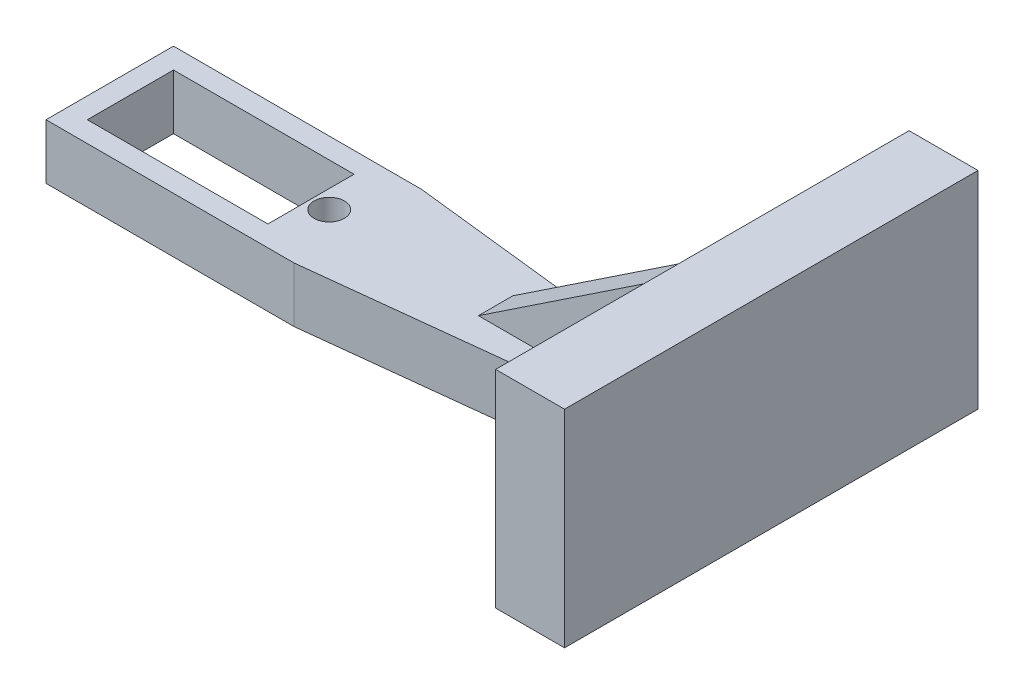
ISO-10303-21;
HEADER;
FILE_DESCRIPTION(('STEP AP214'),'2;1');
FILE_NAME('part.step','',(''),(''),'','','');
FILE_SCHEMA(('AUTOMOTIVE_DESIGN { 1 0 10303 214 1 1 1 1 }'));
ENDSEC;
DATA;
#1=APPLICATION_CONTEXT('core data for automotive mechanical design processes');
#2=APPLICATION_PROTOCOL_DEFINITION('international standard','automotive_design',2000,#1);
#3=PRODUCT_CONTEXT('',#1,'mechanical');
#4=PRODUCT('Part','Part','',(#3));
#5=PRODUCT_RELATED_PRODUCT_CATEGORY('part','',(#4));
#6=PRODUCT_DEFINITION_FORMATION('','',#4);
#7=PRODUCT_DEFINITION_CONTEXT('part definition',#1,'design');
#8=PRODUCT_DEFINITION('design','',#6,#7);
#9=PRODUCT_DEFINITION_SHAPE('','',#8);
#10=(LENGTH_UNIT() NAMED_UNIT(*) SI_UNIT(.MILLI.,.METRE.));
#11=(NAMED_UNIT(*) PLANE_ANGLE_UNIT() SI_UNIT($,.RADIAN.));
#12=(NAMED_UNIT(*) SI_UNIT($,.STERADIAN.) SOLID_ANGLE_UNIT());
#13=UNCERTAINTY_MEASURE_WITH_UNIT(LENGTH_MEASURE(1.E-05),#10,'distance_accuracy_value','');
#14=(GEOMETRIC_REPRESENTATION_CONTEXT(3) GLOBAL_UNCERTAINTY_ASSIGNED_CONTEXT((#13)) GLOBAL_UNIT_ASSIGNED_CONTEXT((#10,
#11,#12)) REPRESENTATION_CONTEXT('',''));
#15=CARTESIAN_POINT('',(0.,0.,0.));
#16=DIRECTION('',(0.,0.,1.));
#17=DIRECTION('',(1.,0.,0.));
#18=AXIS2_PLACEMENT_3D('',#15,#16,#17);
#19=CARTESIAN_POINT('',(0.,8.,0.));
#20=DIRECTION('',(0.,-1.,0.));
#21=DIRECTION('',(0.,0.,-1.));
#22=AXIS2_PLACEMENT_3D('',#19,#20,#21);
#23=PLANE('',#22);
#24=DIRECTION('',(0.,0.,1.));
#25=VECTOR('',#24,1.);
#26=CARTESIAN_POINT('',(-33.,8.,-6.25));
#27=LINE('',#26,#25);
#28=CARTESIAN_POINT('',(-33.,8.,-6.25));
#29=VERTEX_POINT('',#28);
#30=CARTESIAN_POINT('',(-33.,8.,6.25));
#31=VERTEX_POINT('',#30);
#32=EDGE_CURVE('E270',#29,#31,#27,.T.);
#33=ORIENTED_EDGE('',*,*,#32,.F.);
#34=DIRECTION('',(-1.,0.,0.));
#35=VECTOR('',#34,1.);
#36=CARTESIAN_POINT('',(-6.8,8.,-6.25));
#37=LINE('',#36,#35);
#38=CARTESIAN_POINT('',(-6.8,8.,-6.25));
#39=VERTEX_POINT('',#38);
#40=EDGE_CURVE('E278',#39,#29,#37,.T.);
#41=ORIENTED_EDGE('',*,*,#40,.F.);
#42=DIRECTION('',(0.,0.,-1.));
#43=VECTOR('',#42,1.);
#44=CARTESIAN_POINT('',(-6.8,8.,-6.25));
#45=LINE('',#44,#43);
#46=CARTESIAN_POINT('',(-6.79999999999999,8.,6.25));
#47=VERTEX_POINT('',#46);
#48=EDGE_CURVE('E275',#47,#39,#45,.T.);
#49=ORIENTED_EDGE('',*,*,#48,.F.);
#50=DIRECTION('',(1.,0.,0.));
#51=VECTOR('',#50,1.);
#52=CARTESIAN_POINT('',(-29.2,8.,6.25));
#53=LINE('',#52,#51);
#54=EDGE_CURVE('E272',#31,#47,#53,.T.);
#55=ORIENTED_EDGE('',*,*,#54,.F.);
#56=EDGE_LOOP('',(#33,#41,#49,#55));
#57=FACE_BOUND('',#56,.T.);
#58=CARTESIAN_POINT('',(-4.15,8.,0.));
#59=DIRECTION('',(0.,1.,0.));
#60=DIRECTION('',(0.,0.,1.));
#61=AXIS2_PLACEMENT_3D('',#58,#59,#60);
#62=CIRCLE('',#61,2.19999999999999);
#63=CARTESIAN_POINT('',(-4.15,8.,2.19999999999999));
#64=VERTEX_POINT('',#63);
#65=EDGE_CURVE('E257',#64,#64,#62,.T.);
#66=ORIENTED_EDGE('',*,*,#65,.F.);
#67=EDGE_LOOP('',(#66));
#68=FACE_BOUND('',#67,.T.);
#69=DIRECTION('',(1.,0.,0.));
#70=VECTOR('',#69,1.);
#71=CARTESIAN_POINT('',(50.,8.,2.5));
#72=LINE('',#71,#70);
#73=CARTESIAN_POINT('',(20.,8.,2.5));
#74=VERTEX_POINT('',#73);
#75=CARTESIAN_POINT('',(50.,8.,2.5));
#76=VERTEX_POINT('',#75);
#77=EDGE_CURVE('E73',#74,#76,#72,.T.);
#78=ORIENTED_EDGE('',*,*,#77,.F.);
#79=DIRECTION('',(0.,0.,-1.));
#80=VECTOR('',#79,1.);
#81=CARTESIAN_POINT('',(20.,8.,2.5));
#82=LINE('',#81,#80);
#83=CARTESIAN_POINT('',(20.,8.,-2.5));
#84=VERTEX_POINT('',#83);
#85=EDGE_CURVE('E78',#74,#84,#82,.T.);
#86=ORIENTED_EDGE('',*,*,#85,.T.);
#87=DIRECTION('',(1.,0.,0.));
#88=VECTOR('',#87,1.);
#89=CARTESIAN_POINT('',(50.,8.,-2.5));
#90=LINE('',#89,#88);
#91=CARTESIAN_POINT('',(50.,8.,-2.5));
#92=VERTEX_POINT('',#91);
#93=EDGE_CURVE('E190',#84,#92,#90,.T.);
#94=ORIENTED_EDGE('',*,*,#93,.T.);
#95=DIRECTION('',(0.,0.,-1.));
#96=VECTOR('',#95,1.);
#97=CARTESIAN_POINT('',(50.,8.,0.));
#98=LINE('',#97,#96);
#99=CARTESIAN_POINT('',(50.,8.,-3.625));
#100=VERTEX_POINT('',#99);
#101=EDGE_CURVE('E177',#92,#100,#98,.T.);
#102=ORIENTED_EDGE('',*,*,#101,.T.);
#103=DIRECTION('',(0.993731316158802,0.,0.111794773067865));
#104=VECTOR('',#103,1.);
#105=CARTESIAN_POINT('',(0.,8.,-9.25));
#106=LINE('',#105,#104);
#107=CARTESIAN_POINT('',(2.03418209003144E-13,8.,-9.24999999999999));
#108=VERTEX_POINT('',#107);
#109=EDGE_CURVE('E238',#108,#100,#106,.T.);
#110=ORIENTED_EDGE('',*,*,#109,.F.);
#111=DIRECTION('',(-1.,0.,0.));
#112=VECTOR('',#111,1.);
#113=CARTESIAN_POINT('',(-36.,8.,-9.25));
#114=LINE('',#113,#112);
#115=CARTESIAN_POINT('',(-36.,8.,-9.25));
#116=VERTEX_POINT('',#115);
#117=EDGE_CURVE('E314',#108,#116,#114,.T.);
#118=ORIENTED_EDGE('',*,*,#117,.T.);
#119=DIRECTION('',(0.,0.,1.));
#120=VECTOR('',#119,1.);
#121=CARTESIAN_POINT('',(-36.,8.,9.25));
#122=LINE('',#121,#120);
#123=CARTESIAN_POINT('',(-36.,8.,9.25));
#124=VERTEX_POINT('',#123);
#125=EDGE_CURVE('E302',#116,#124,#122,.T.);
#126=ORIENTED_EDGE('',*,*,#125,.T.);
#127=DIRECTION('',(1.,0.,0.));
#128=VECTOR('',#127,1.);
#129=CARTESIAN_POINT('',(-36.,8.,9.25));
#130=LINE('',#129,#128);
#131=CARTESIAN_POINT('',(1.93053229542609E-13,8.,9.24999999999999));
#132=VERTEX_POINT('',#131);
#133=EDGE_CURVE('E305',#124,#132,#130,.T.);
#134=ORIENTED_EDGE('',*,*,#133,.T.);
#135=DIRECTION('',(0.993731316158802,0.,-0.111794773067865));
#136=VECTOR('',#135,1.);
#137=CARTESIAN_POINT('',(0.,8.,9.25));
#138=LINE('',#137,#136);
#139=CARTESIAN_POINT('',(50.,8.,3.625));
#140=VERTEX_POINT('',#139);
#141=EDGE_CURVE('E237',#132,#140,#138,.T.);
#142=ORIENTED_EDGE('',*,*,#141,.T.);
#143=EDGE_CURVE('E186',#140,#76,#98,.T.);
#144=ORIENTED_EDGE('',*,*,#143,.T.);
#145=EDGE_LOOP('',(#78,#86,#94,#102,#110,#118,#126,#134,#142,#144));
#146=FACE_BOUND('',#145,.T.);
#147=ADVANCED_FACE('F56',(#57,#68,#146),#23,.F.);
#148=CARTESIAN_POINT('',(50.,0.,0.));
#149=DIRECTION('',(-1.,0.,0.));
#150=DIRECTION('',(0.,0.,1.));
#151=AXIS2_PLACEMENT_3D('',#148,#149,#150);
#152=PLANE('',#151);
#153=DIRECTION('',(0.,0.,-1.));
#154=VECTOR('',#153,1.);
#155=CARTESIAN_POINT('',(50.,28.,2.5));
#156=LINE('',#155,#154);
#157=CARTESIAN_POINT('',(50.,28.,2.5));
#158=VERTEX_POINT('',#157);
#159=CARTESIAN_POINT('',(50.,28.,-2.5));
#160=VERTEX_POINT('',#159);
#161=EDGE_CURVE('E203',#158,#160,#156,.T.);
#162=ORIENTED_EDGE('',*,*,#161,.F.);
#163=DIRECTION('',(0.,1.,0.));
#164=VECTOR('',#163,1.);
#165=CARTESIAN_POINT('',(50.,28.,2.5));
#166=LINE('',#165,#164);
#167=EDGE_CURVE('E192',#76,#158,#166,.T.);
#168=ORIENTED_EDGE('',*,*,#167,.F.);
#169=ORIENTED_EDGE('',*,*,#143,.F.);
#170=DIRECTION('',(0.,1.,0.));
#171=VECTOR('',#170,1.);
#172=CARTESIAN_POINT('',(50.,0.,3.625));
#173=LINE('',#172,#171);
#174=CARTESIAN_POINT('',(50.,0.,3.625));
#175=VERTEX_POINT('',#174);
#176=EDGE_CURVE('E14',#175,#140,#173,.T.);
#177=ORIENTED_EDGE('',*,*,#176,.F.);
#178=DIRECTION('',(0.,0.,-1.));
#179=VECTOR('',#178,1.);
#180=CARTESIAN_POINT('',(50.,0.,30.));
#181=LINE('',#180,#179);
#182=CARTESIAN_POINT('',(50.,0.,30.));
#183=VERTEX_POINT('',#182);
#184=EDGE_CURVE('E217',#183,#175,#181,.T.);
#185=ORIENTED_EDGE('',*,*,#184,.F.);
#186=DIRECTION('',(0.,-1.,0.));
#187=VECTOR('',#186,1.);
#188=CARTESIAN_POINT('',(50.,0.,30.));
#189=LINE('',#188,#187);
#190=CARTESIAN_POINT('',(50.,30.,30.));
#191=VERTEX_POINT('',#190);
#192=EDGE_CURVE('E213',#191,#183,#189,.T.);
#193=ORIENTED_EDGE('',*,*,#192,.F.);
#194=DIRECTION('',(0.,0.,1.));
#195=VECTOR('',#194,1.);
#196=CARTESIAN_POINT('',(50.,30.,30.));
#197=LINE('',#196,#195);
#198=CARTESIAN_POINT('',(50.,30.,-30.));
#199=VERTEX_POINT('',#198);
#200=EDGE_CURVE('E209',#199,#191,#197,.T.);
#201=ORIENTED_EDGE('',*,*,#200,.F.);
#202=DIRECTION('',(0.,1.,0.));
#203=VECTOR('',#202,1.);
#204=CARTESIAN_POINT('',(50.,0.,-30.));
#205=LINE('',#204,#203);
#206=CARTESIAN_POINT('',(50.,0.,-30.));
#207=VERTEX_POINT('',#206);
#208=EDGE_CURVE('E206',#207,#199,#205,.T.);
#209=ORIENTED_EDGE('',*,*,#208,.F.);
#210=CARTESIAN_POINT('',(50.,0.,-3.625));
#211=VERTEX_POINT('',#210);
#212=EDGE_CURVE('E216',#211,#207,#181,.T.);
#213=ORIENTED_EDGE('',*,*,#212,.F.);
#214=DIRECTION('',(0.,-1.,0.));
#215=VECTOR('',#214,1.);
#216=CARTESIAN_POINT('',(50.,0.,-3.625));
#217=LINE('',#216,#215);
#218=EDGE_CURVE('E183',#100,#211,#217,.T.);
#219=ORIENTED_EDGE('',*,*,#218,.F.);
#220=ORIENTED_EDGE('',*,*,#101,.F.);
#221=DIRECTION('',(0.,1.,0.));
#222=VECTOR('',#221,1.);
#223=CARTESIAN_POINT('',(50.,28.,-2.5));
#224=LINE('',#223,#222);
#225=EDGE_CURVE('E180',#92,#160,#224,.T.);
#226=ORIENTED_EDGE('',*,*,#225,.T.);
#227=EDGE_LOOP('',(#162,#168,#169,#177,#185,#193,#201,#209,#213,#219,#220,#226));
#228=FACE_BOUND('',#227,.T.);
#229=ADVANCED_FACE('F178',(#228),#152,.T.);
#230=CARTESIAN_POINT('',(0.,0.,0.));
#231=DIRECTION('',(0.,-1.,0.));
#232=DIRECTION('',(0.,0.,-1.));
#233=AXIS2_PLACEMENT_3D('',#230,#231,#232);
#234=PLANE('',#233);
#235=DIRECTION('',(0.993731316158802,0.,0.111794773067865));
#236=VECTOR('',#235,1.);
#237=CARTESIAN_POINT('',(0.,0.,-9.25));
#238=LINE('',#237,#236);
#239=CARTESIAN_POINT('',(2.03418209003144E-13,0.,-9.24999999999999));
#240=VERTEX_POINT('',#239);
#241=EDGE_CURVE('E249',#240,#211,#238,.T.);
#242=ORIENTED_EDGE('',*,*,#241,.T.);
#243=ORIENTED_EDGE('',*,*,#212,.T.);
#244=DIRECTION('',(1.,0.,0.));
#245=VECTOR('',#244,1.);
#246=CARTESIAN_POINT('',(50.,0.,-30.));
#247=LINE('',#246,#245);
#248=CARTESIAN_POINT('',(60.,0.,-30.));
#249=VERTEX_POINT('',#248);
#250=EDGE_CURVE('E187',#207,#249,#247,.T.);
#251=ORIENTED_EDGE('',*,*,#250,.T.);
#252=DIRECTION('',(0.,0.,-1.));
#253=VECTOR('',#252,1.);
#254=CARTESIAN_POINT('',(60.,0.,2.5));
#255=LINE('',#254,#253);
#256=CARTESIAN_POINT('',(60.,0.,30.));
#257=VERTEX_POINT('',#256);
#258=EDGE_CURVE('E254',#257,#249,#255,.T.);
#259=ORIENTED_EDGE('',*,*,#258,.F.);
#260=DIRECTION('',(1.,0.,0.));
#261=VECTOR('',#260,1.);
#262=CARTESIAN_POINT('',(50.,0.,30.));
#263=LINE('',#262,#261);
#264=EDGE_CURVE('E230',#183,#257,#263,.T.);
#265=ORIENTED_EDGE('',*,*,#264,.F.);
#266=ORIENTED_EDGE('',*,*,#184,.T.);
#267=DIRECTION('',(0.993731316158802,0.,-0.111794773067865));
#268=VECTOR('',#267,1.);
#269=CARTESIAN_POINT('',(0.,0.,9.25));
#270=LINE('',#269,#268);
#271=CARTESIAN_POINT('',(1.93053229542609E-13,0.,9.24999999999999));
#272=VERTEX_POINT('',#271);
#273=EDGE_CURVE('E240',#272,#175,#270,.T.);
#274=ORIENTED_EDGE('',*,*,#273,.F.);
#275=DIRECTION('',(1.,0.,0.));
#276=VECTOR('',#275,1.);
#277=CARTESIAN_POINT('',(-36.,0.,9.25));
#278=LINE('',#277,#276);
#279=CARTESIAN_POINT('',(-36.,0.,9.25));
#280=VERTEX_POINT('',#279);
#281=EDGE_CURVE('E309',#280,#272,#278,.T.);
#282=ORIENTED_EDGE('',*,*,#281,.F.);
#283=DIRECTION('',(0.,0.,1.));
#284=VECTOR('',#283,1.);
#285=CARTESIAN_POINT('',(-36.,0.,9.25));
#286=LINE('',#285,#284);
#287=CARTESIAN_POINT('',(-36.,0.,-9.25));
#288=VERTEX_POINT('',#287);
#289=EDGE_CURVE('E301',#288,#280,#286,.T.);
#290=ORIENTED_EDGE('',*,*,#289,.F.);
#291=DIRECTION('',(-1.,0.,0.));
#292=VECTOR('',#291,1.);
#293=CARTESIAN_POINT('',(-36.,0.,-9.25));
#294=LINE('',#293,#292);
#295=EDGE_CURVE('E306',#240,#288,#294,.T.);
#296=ORIENTED_EDGE('',*,*,#295,.F.);
#297=EDGE_LOOP('',(#242,#243,#251,#259,#265,#266,#274,#282,#290,#296));
#298=FACE_BOUND('',#297,.T.);
#299=CARTESIAN_POINT('',(-4.15,0.,0.));
#300=DIRECTION('',(0.,-1.,0.));
#301=DIRECTION('',(0.,0.,-1.));
#302=AXIS2_PLACEMENT_3D('',#299,#300,#301);
#303=CIRCLE('',#302,1.2);
#304=CARTESIAN_POINT('',(-4.15,0.,-1.2));
#305=VERTEX_POINT('',#304);
#306=EDGE_CURVE('E266',#305,#305,#303,.T.);
#307=ORIENTED_EDGE('',*,*,#306,.F.);
#308=EDGE_LOOP('',(#307));
#309=FACE_BOUND('',#308,.T.);
#310=DIRECTION('',(-1.,0.,0.));
#311=VECTOR('',#310,1.);
#312=CARTESIAN_POINT('',(-29.2,0.,-6.25));
#313=LINE('',#312,#311);
#314=CARTESIAN_POINT('',(-6.8,0.,-6.25));
#315=VERTEX_POINT('',#314);
#316=CARTESIAN_POINT('',(-33.,0.,-6.25));
#317=VERTEX_POINT('',#316);
#318=EDGE_CURVE('E273',#315,#317,#313,.T.);
#319=ORIENTED_EDGE('',*,*,#318,.T.);
#320=DIRECTION('',(0.,0.,1.));
#321=VECTOR('',#320,1.);
#322=CARTESIAN_POINT('',(-33.,0.,-6.25));
#323=LINE('',#322,#321);
#324=CARTESIAN_POINT('',(-33.,0.,6.25));
#325=VERTEX_POINT('',#324);
#326=EDGE_CURVE('E269',#317,#325,#323,.T.);
#327=ORIENTED_EDGE('',*,*,#326,.T.);
#328=DIRECTION('',(1.,0.,0.));
#329=VECTOR('',#328,1.);
#330=CARTESIAN_POINT('',(-6.79999999999999,0.,6.25));
#331=LINE('',#330,#329);
#332=CARTESIAN_POINT('',(-6.79999999999999,0.,6.25));
#333=VERTEX_POINT('',#332);
#334=EDGE_CURVE('E283',#325,#333,#331,.T.);
#335=ORIENTED_EDGE('',*,*,#334,.T.);
#336=DIRECTION('',(0.,0.,-1.));
#337=VECTOR('',#336,1.);
#338=CARTESIAN_POINT('',(-6.8,0.,-6.25));
#339=LINE('',#338,#337);
#340=EDGE_CURVE('E286',#333,#315,#339,.T.);
#341=ORIENTED_EDGE('',*,*,#340,.T.);
#342=EDGE_LOOP('',(#319,#327,#335,#341));
#343=FACE_BOUND('',#342,.T.);
#344=ADVANCED_FACE('F330',(#298,#309,#343),#234,.T.);
#345=CARTESIAN_POINT('',(-36.,8.,9.25));
#346=DIRECTION('',(1.,0.,0.));
#347=DIRECTION('',(0.,0.,-1.));
#348=AXIS2_PLACEMENT_3D('',#345,#346,#347);
#349=PLANE('',#348);
#350=ORIENTED_EDGE('',*,*,#289,.T.);
#351=DIRECTION('',(0.,-1.,0.));
#352=VECTOR('',#351,1.);
#353=CARTESIAN_POINT('',(-36.,8.,9.25));
#354=LINE('',#353,#352);
#355=EDGE_CURVE('E65',#124,#280,#354,.T.);
#356=ORIENTED_EDGE('',*,*,#355,.F.);
#357=ORIENTED_EDGE('',*,*,#125,.F.);
#358=DIRECTION('',(0.,-1.,0.));
#359=VECTOR('',#358,1.);
#360=CARTESIAN_POINT('',(-36.,8.,-9.25));
#361=LINE('',#360,#359);
#362=EDGE_CURVE('E310',#116,#288,#361,.T.);
#363=ORIENTED_EDGE('',*,*,#362,.T.);
#364=EDGE_LOOP('',(#350,#356,#357,#363));
#365=FACE_BOUND('',#364,.T.);
#366=ADVANCED_FACE('F58',(#365),#349,.F.);
#367=CARTESIAN_POINT('',(-36.,8.,9.25));
#368=DIRECTION('',(0.,0.,-1.));
#369=DIRECTION('',(-1.,0.,0.));
#370=AXIS2_PLACEMENT_3D('',#367,#368,#369);
#371=PLANE('',#370);
#372=ORIENTED_EDGE('',*,*,#281,.T.);
#373=DIRECTION('',(0.,1.,0.));
#374=VECTOR('',#373,1.);
#375=CARTESIAN_POINT('',(0.,0.,9.25));
#376=LINE('',#375,#374);
#377=EDGE_CURVE('E317',#132,#272,#376,.F.);
#378=ORIENTED_EDGE('',*,*,#377,.F.);
#379=ORIENTED_EDGE('',*,*,#133,.F.);
#380=ORIENTED_EDGE('',*,*,#355,.T.);
#381=EDGE_LOOP('',(#372,#378,#379,#380));
#382=FACE_BOUND('',#381,.T.);
#383=ADVANCED_FACE('F349',(#382),#371,.F.);
#384=CARTESIAN_POINT('',(-36.,8.,-9.25));
#385=DIRECTION('',(0.,0.,1.));
#386=DIRECTION('',(1.,0.,0.));
#387=AXIS2_PLACEMENT_3D('',#384,#385,#386);
#388=PLANE('',#387);
#389=ORIENTED_EDGE('',*,*,#295,.T.);
#390=ORIENTED_EDGE('',*,*,#362,.F.);
#391=ORIENTED_EDGE('',*,*,#117,.F.);
#392=DIRECTION('',(0.,1.,0.));
#393=VECTOR('',#392,1.);
#394=CARTESIAN_POINT('',(0.,8.,-9.25));
#395=LINE('',#394,#393);
#396=EDGE_CURVE('E313',#108,#240,#395,.F.);
#397=ORIENTED_EDGE('',*,*,#396,.T.);
#398=EDGE_LOOP('',(#389,#390,#391,#397));
#399=FACE_BOUND('',#398,.T.);
#400=ADVANCED_FACE('F358',(#399),#388,.F.);
#401=CARTESIAN_POINT('',(-33.,8.,-6.25));
#402=DIRECTION('',(1.,0.,0.));
#403=DIRECTION('',(0.,0.,-1.));
#404=AXIS2_PLACEMENT_3D('',#401,#402,#403);
#405=PLANE('',#404);
#406=ORIENTED_EDGE('',*,*,#326,.F.);
#407=DIRECTION('',(0.,-1.,0.));
#408=VECTOR('',#407,1.);
#409=CARTESIAN_POINT('',(-33.,8.,-6.25));
#410=LINE('',#409,#408);
#411=EDGE_CURVE('E280',#29,#317,#410,.T.);
#412=ORIENTED_EDGE('',*,*,#411,.F.);
#413=ORIENTED_EDGE('',*,*,#32,.T.);
#414=DIRECTION('',(0.,-1.,0.));
#415=VECTOR('',#414,1.);
#416=CARTESIAN_POINT('',(-33.,8.,6.25));
#417=LINE('',#416,#415);
#418=EDGE_CURVE('E298',#31,#325,#417,.T.);
#419=ORIENTED_EDGE('',*,*,#418,.T.);
#420=EDGE_LOOP('',(#406,#412,#413,#419));
#421=FACE_BOUND('',#420,.T.);
#422=ADVANCED_FACE('F390',(#421),#405,.T.);
#423=CARTESIAN_POINT('',(-6.79999999999999,8.,6.25));
#424=DIRECTION('',(0.,0.,-1.));
#425=DIRECTION('',(-1.,0.,0.));
#426=AXIS2_PLACEMENT_3D('',#423,#424,#425);
#427=PLANE('',#426);
#428=ORIENTED_EDGE('',*,*,#334,.F.);
#429=ORIENTED_EDGE('',*,*,#418,.F.);
#430=ORIENTED_EDGE('',*,*,#54,.T.);
#431=DIRECTION('',(0.,-1.,0.));
#432=VECTOR('',#431,1.);
#433=CARTESIAN_POINT('',(-6.79999999999999,8.,6.25));
#434=LINE('',#433,#432);
#435=EDGE_CURVE('E296',#47,#333,#434,.T.);
#436=ORIENTED_EDGE('',*,*,#435,.T.);
#437=EDGE_LOOP('',(#428,#429,#430,#436));
#438=FACE_BOUND('',#437,.T.);
#439=ADVANCED_FACE('F523',(#438),#427,.T.);
#440=CARTESIAN_POINT('',(-6.8,8.,-6.25));
#441=DIRECTION('',(-1.,0.,0.));
#442=DIRECTION('',(0.,0.,1.));
#443=AXIS2_PLACEMENT_3D('',#440,#441,#442);
#444=PLANE('',#443);
#445=ORIENTED_EDGE('',*,*,#340,.F.);
#446=ORIENTED_EDGE('',*,*,#435,.F.);
#447=ORIENTED_EDGE('',*,*,#48,.T.);
#448=DIRECTION('',(0.,-1.,0.));
#449=VECTOR('',#448,1.);
#450=CARTESIAN_POINT('',(-6.8,8.,-6.25));
#451=LINE('',#450,#449);
#452=EDGE_CURVE('E293',#39,#315,#451,.T.);
#453=ORIENTED_EDGE('',*,*,#452,.T.);
#454=EDGE_LOOP('',(#445,#446,#447,#453));
#455=FACE_BOUND('',#454,.T.);
#456=ADVANCED_FACE('F515',(#455),#444,.T.);
#457=CARTESIAN_POINT('',(-29.2,8.,-6.25));
#458=DIRECTION('',(0.,0.,1.));
#459=DIRECTION('',(1.,0.,0.));
#460=AXIS2_PLACEMENT_3D('',#457,#458,#459);
#461=PLANE('',#460);
#462=ORIENTED_EDGE('',*,*,#318,.F.);
#463=ORIENTED_EDGE('',*,*,#452,.F.);
#464=ORIENTED_EDGE('',*,*,#40,.T.);
#465=ORIENTED_EDGE('',*,*,#411,.T.);
#466=EDGE_LOOP('',(#462,#463,#464,#465));
#467=FACE_BOUND('',#466,.T.);
#468=ADVANCED_FACE('F507',(#467),#461,.T.);
#469=CARTESIAN_POINT('',(-4.15,8.,0.));
#470=DIRECTION('',(0.,1.,0.));
#471=DIRECTION('',(0.,0.,1.));
#472=AXIS2_PLACEMENT_3D('',#469,#470,#471);
#473=CYLINDRICAL_SURFACE('',#472,1.2);
#474=CARTESIAN_POINT('',(-4.15,4.5,0.));
#475=DIRECTION('',(0.,1.,0.));
#476=DIRECTION('',(0.,0.,1.));
#477=AXIS2_PLACEMENT_3D('',#474,#475,#476);
#478=CIRCLE('',#477,1.2);
#479=CARTESIAN_POINT('',(-4.15,4.5,1.2));
#480=VERTEX_POINT('',#479);
#481=EDGE_CURVE('E263',#480,#480,#478,.T.);
#482=ORIENTED_EDGE('',*,*,#481,.T.);
#483=EDGE_LOOP('',(#482));
#484=FACE_BOUND('',#483,.T.);
#485=ORIENTED_EDGE('',*,*,#306,.T.);
#486=EDGE_LOOP('',(#485));
#487=FACE_BOUND('',#486,.T.);
#488=ADVANCED_FACE('F499',(#484,#487),#473,.F.);
#489=CARTESIAN_POINT('',(-2.95,4.5,0.));
#490=DIRECTION('',(0.,-1.,0.));
#491=DIRECTION('',(0.,0.,-1.));
#492=AXIS2_PLACEMENT_3D('',#489,#490,#491);
#493=PLANE('',#492);
#494=ORIENTED_EDGE('',*,*,#481,.F.);
#495=EDGE_LOOP('',(#494));
#496=FACE_BOUND('',#495,.T.);
#497=CARTESIAN_POINT('',(-4.15,4.5,0.));
#498=DIRECTION('',(0.,1.,0.));
#499=DIRECTION('',(0.,0.,1.));
#500=AXIS2_PLACEMENT_3D('',#497,#498,#499);
#501=CIRCLE('',#500,2.2);
#502=CARTESIAN_POINT('',(-4.15,4.5,2.2));
#503=VERTEX_POINT('',#502);
#504=EDGE_CURVE('E260',#503,#503,#501,.T.);
#505=ORIENTED_EDGE('',*,*,#504,.T.);
#506=EDGE_LOOP('',(#505));
#507=FACE_BOUND('',#506,.T.);
#508=ADVANCED_FACE('F491',(#496,#507),#493,.F.);
#509=CARTESIAN_POINT('',(-4.15,8.,0.));
#510=DIRECTION('',(0.,1.,0.));
#511=DIRECTION('',(0.,0.,1.));
#512=AXIS2_PLACEMENT_3D('',#509,#510,#511);
#513=CYLINDRICAL_SURFACE('',#512,2.2);
#514=ORIENTED_EDGE('',*,*,#504,.F.);
#515=EDGE_LOOP('',(#514));
#516=FACE_BOUND('',#515,.T.);
#517=ORIENTED_EDGE('',*,*,#65,.T.);
#518=EDGE_LOOP('',(#517));
#519=FACE_BOUND('',#518,.T.);
#520=ADVANCED_FACE('F482',(#516,#519),#513,.F.);
#521=CARTESIAN_POINT('',(60.,0.,0.));
#522=DIRECTION('',(1.,0.,0.));
#523=DIRECTION('',(0.,0.,-1.));
#524=AXIS2_PLACEMENT_3D('',#521,#522,#523);
#525=PLANE('',#524);
#526=ORIENTED_EDGE('',*,*,#258,.T.);
#527=DIRECTION('',(0.,1.,0.));
#528=VECTOR('',#527,1.);
#529=CARTESIAN_POINT('',(60.,0.,-30.));
#530=LINE('',#529,#528);
#531=CARTESIAN_POINT('',(60.,30.,-30.));
#532=VERTEX_POINT('',#531);
#533=EDGE_CURVE('E205',#249,#532,#530,.T.);
#534=ORIENTED_EDGE('',*,*,#533,.T.);
#535=DIRECTION('',(0.,0.,1.));
#536=VECTOR('',#535,1.);
#537=CARTESIAN_POINT('',(60.,30.,30.));
#538=LINE('',#537,#536);
#539=CARTESIAN_POINT('',(60.,30.,30.));
#540=VERTEX_POINT('',#539);
#541=EDGE_CURVE('E223',#532,#540,#538,.T.);
#542=ORIENTED_EDGE('',*,*,#541,.T.);
#543=DIRECTION('',(0.,-1.,0.));
#544=VECTOR('',#543,1.);
#545=CARTESIAN_POINT('',(60.,0.,30.));
#546=LINE('',#545,#544);
#547=EDGE_CURVE('E210',#540,#257,#546,.T.);
#548=ORIENTED_EDGE('',*,*,#547,.T.);
#549=EDGE_LOOP('',(#526,#534,#542,#548));
#550=FACE_BOUND('',#549,.T.);
#551=ADVANCED_FACE('F325',(#550),#525,.T.);
#552=CARTESIAN_POINT('',(1.02761919456874,0.,-9.13439284061102));
#553=DIRECTION('',(-0.111794773067865,0.,0.993731316158802));
#554=DIRECTION('',(0.993731316158802,0.,0.111794773067865));
#555=AXIS2_PLACEMENT_3D('',#552,#553,#554);
#556=PLANE('',#555);
#557=ORIENTED_EDGE('',*,*,#109,.T.);
#558=ORIENTED_EDGE('',*,*,#218,.T.);
#559=ORIENTED_EDGE('',*,*,#241,.F.);
#560=ORIENTED_EDGE('',*,*,#396,.F.);
#561=EDGE_LOOP('',(#557,#558,#559,#560));
#562=FACE_BOUND('',#561,.T.);
#563=ADVANCED_FACE('F361',(#562),#556,.F.);
#564=CARTESIAN_POINT('',(1.02761919456874,0.,9.13439284061102));
#565=DIRECTION('',(-0.111794773067865,0.,-0.993731316158802));
#566=DIRECTION('',(-0.993731316158802,0.,0.111794773067865));
#567=AXIS2_PLACEMENT_3D('',#564,#565,#566);
#568=PLANE('',#567);
#569=ORIENTED_EDGE('',*,*,#273,.T.);
#570=ORIENTED_EDGE('',*,*,#176,.T.);
#571=ORIENTED_EDGE('',*,*,#141,.F.);
#572=ORIENTED_EDGE('',*,*,#377,.T.);
#573=EDGE_LOOP('',(#569,#570,#571,#572));
#574=FACE_BOUND('',#573,.T.);
#575=ADVANCED_FACE('F345',(#574),#568,.F.);
#576=CARTESIAN_POINT('',(50.,0.,-30.));
#577=DIRECTION('',(0.,0.,-1.));
#578=DIRECTION('',(-1.,0.,0.));
#579=AXIS2_PLACEMENT_3D('',#576,#577,#578);
#580=PLANE('',#579);
#581=ORIENTED_EDGE('',*,*,#533,.F.);
#582=ORIENTED_EDGE('',*,*,#250,.F.);
#583=ORIENTED_EDGE('',*,*,#208,.T.);
#584=DIRECTION('',(1.,0.,0.));
#585=VECTOR('',#584,1.);
#586=CARTESIAN_POINT('',(50.,30.,-30.));
#587=LINE('',#586,#585);
#588=EDGE_CURVE('E220',#199,#532,#587,.T.);
#589=ORIENTED_EDGE('',*,*,#588,.T.);
#590=EDGE_LOOP('',(#581,#582,#583,#589));
#591=FACE_BOUND('',#590,.T.);
#592=ADVANCED_FACE('F334',(#591),#580,.T.);
#593=CARTESIAN_POINT('',(50.,0.,30.));
#594=DIRECTION('',(0.,0.,1.));
#595=DIRECTION('',(1.,0.,0.));
#596=AXIS2_PLACEMENT_3D('',#593,#594,#595);
#597=PLANE('',#596);
#598=ORIENTED_EDGE('',*,*,#547,.F.);
#599=DIRECTION('',(1.,0.,0.));
#600=VECTOR('',#599,1.);
#601=CARTESIAN_POINT('',(50.,30.,30.));
#602=LINE('',#601,#600);
#603=EDGE_CURVE('E233',#191,#540,#602,.T.);
#604=ORIENTED_EDGE('',*,*,#603,.F.);
#605=ORIENTED_EDGE('',*,*,#192,.T.);
#606=ORIENTED_EDGE('',*,*,#264,.T.);
#607=EDGE_LOOP('',(#598,#604,#605,#606));
#608=FACE_BOUND('',#607,.T.);
#609=ADVANCED_FACE('F341',(#608),#597,.T.);
#610=CARTESIAN_POINT('',(50.,30.,30.));
#611=DIRECTION('',(0.,1.,0.));
#612=DIRECTION('',(0.,0.,1.));
#613=AXIS2_PLACEMENT_3D('',#610,#611,#612);
#614=PLANE('',#613);
#615=ORIENTED_EDGE('',*,*,#541,.F.);
#616=ORIENTED_EDGE('',*,*,#588,.F.);
#617=ORIENTED_EDGE('',*,*,#200,.T.);
#618=ORIENTED_EDGE('',*,*,#603,.T.);
#619=EDGE_LOOP('',(#615,#616,#617,#618));
#620=FACE_BOUND('',#619,.T.);
#621=ADVANCED_FACE('F338',(#620),#614,.T.);
#622=CARTESIAN_POINT('',(50.,28.,2.5));
#623=DIRECTION('',(0.554700196225229,-0.832050294337844,0.));
#624=DIRECTION('',(0.832050294337844,0.554700196225229,0.));
#625=AXIS2_PLACEMENT_3D('',#622,#623,#624);
#626=PLANE('',#625);
#627=DIRECTION('',(-0.832050294337844,-0.554700196225229,0.));
#628=VECTOR('',#627,1.);
#629=CARTESIAN_POINT('',(50.,28.,-2.5));
#630=LINE('',#629,#628);
#631=EDGE_CURVE('E193',#160,#84,#630,.T.);
#632=ORIENTED_EDGE('',*,*,#631,.T.);
#633=ORIENTED_EDGE('',*,*,#85,.F.);
#634=DIRECTION('',(-0.832050294337844,-0.554700196225229,0.));
#635=VECTOR('',#634,1.);
#636=CARTESIAN_POINT('',(50.,28.,2.5));
#637=LINE('',#636,#635);
#638=EDGE_CURVE('E366',#158,#74,#637,.T.);
#639=ORIENTED_EDGE('',*,*,#638,.F.);
#640=ORIENTED_EDGE('',*,*,#161,.T.);
#641=EDGE_LOOP('',(#632,#633,#639,#640));
#642=FACE_BOUND('',#641,.T.);
#643=ADVANCED_FACE('F369',(#642),#626,.F.);
#644=CARTESIAN_POINT('',(0.,0.,2.5));
#645=DIRECTION('',(0.,0.,-1.));
#646=DIRECTION('',(-1.,0.,0.));
#647=AXIS2_PLACEMENT_3D('',#644,#645,#646);
#648=PLANE('',#647);
#649=ORIENTED_EDGE('',*,*,#167,.T.);
#650=ORIENTED_EDGE('',*,*,#638,.T.);
#651=ORIENTED_EDGE('',*,*,#77,.T.);
#652=EDGE_LOOP('',(#649,#650,#651));
#653=FACE_BOUND('',#652,.T.);
#654=ADVANCED_FACE('F364',(#653),#648,.F.);
#655=CARTESIAN_POINT('',(0.,0.,-2.5));
#656=DIRECTION('',(0.,0.,-1.));
#657=DIRECTION('',(-1.,0.,0.));
#658=AXIS2_PLACEMENT_3D('',#655,#656,#657);
#659=PLANE('',#658);
#660=ORIENTED_EDGE('',*,*,#225,.F.);
#661=ORIENTED_EDGE('',*,*,#93,.F.);
#662=ORIENTED_EDGE('',*,*,#631,.F.);
#663=EDGE_LOOP('',(#660,#661,#662));
#664=FACE_BOUND('',#663,.T.);
#665=ADVANCED_FACE('F195',(#664),#659,.T.);
#666=CLOSED_SHELL('',(#147,#229,#344,#366,#383,#400,#422,#439,#456,#468,#488,#508,#520,#551,
#563,#575,#592,#609,#621,#643,#654,#665));
#667=MANIFOLD_SOLID_BREP('B2',#666);
#668=ADVANCED_BREP_SHAPE_REPRESENTATION('',(#18,#667),#14);
#669=SHAPE_DEFINITION_REPRESENTATION(#9,#668);
ENDSEC;
END-ISO-10303-21;
